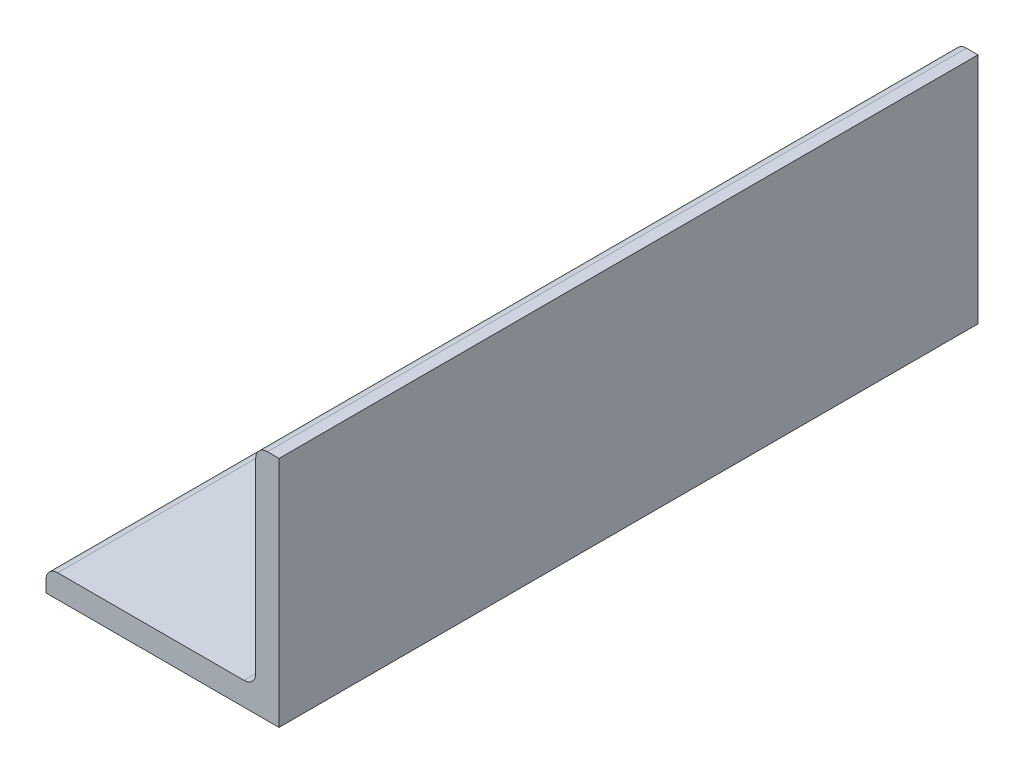
ISO-10303-21;
HEADER;
FILE_DESCRIPTION(('STEP AP214'),'2;1');
FILE_NAME('part.step','',(''),(''),'','','');
FILE_SCHEMA(('AUTOMOTIVE_DESIGN { 1 0 10303 214 1 1 1 1 }'));
ENDSEC;
DATA;
#1=APPLICATION_CONTEXT('core data for automotive mechanical design processes');
#2=APPLICATION_PROTOCOL_DEFINITION('international standard','automotive_design',2000,#1);
#3=PRODUCT_CONTEXT('',#1,'mechanical');
#4=PRODUCT('Part','Part','',(#3));
#5=PRODUCT_RELATED_PRODUCT_CATEGORY('part','',(#4));
#6=PRODUCT_DEFINITION_FORMATION('','',#4);
#7=PRODUCT_DEFINITION_CONTEXT('part definition',#1,'design');
#8=PRODUCT_DEFINITION('design','',#6,#7);
#9=PRODUCT_DEFINITION_SHAPE('','',#8);
#10=(LENGTH_UNIT() NAMED_UNIT(*) SI_UNIT(.MILLI.,.METRE.));
#11=(NAMED_UNIT(*) PLANE_ANGLE_UNIT() SI_UNIT($,.RADIAN.));
#12=(NAMED_UNIT(*) SI_UNIT($,.STERADIAN.) SOLID_ANGLE_UNIT());
#13=UNCERTAINTY_MEASURE_WITH_UNIT(LENGTH_MEASURE(1.E-05),#10,'distance_accuracy_value','');
#14=(GEOMETRIC_REPRESENTATION_CONTEXT(3) GLOBAL_UNCERTAINTY_ASSIGNED_CONTEXT((#13)) GLOBAL_UNIT_ASSIGNED_CONTEXT((#10,
#11,#12)) REPRESENTATION_CONTEXT('',''));
#15=CARTESIAN_POINT('',(0.,0.,0.));
#16=DIRECTION('',(0.,0.,1.));
#17=DIRECTION('',(1.,0.,0.));
#18=AXIS2_PLACEMENT_3D('',#15,#16,#17);
#19=CARTESIAN_POINT('',(-137.100940306666,27.,90.));
#20=DIRECTION('',(0.,-1.,0.));
#21=DIRECTION('',(0.,0.,-1.));
#22=AXIS2_PLACEMENT_3D('',#19,#20,#21);
#23=PLANE('',#22);
#24=DIRECTION('',(-1.,0.,0.));
#25=VECTOR('',#24,1.);
#26=CARTESIAN_POINT('',(-137.100940306666,27.,0.));
#27=LINE('',#26,#25);
#28=CARTESIAN_POINT('',(-135.600940306666,27.,0.));
#29=VERTEX_POINT('',#28);
#30=CARTESIAN_POINT('',(-137.100940306666,27.,0.));
#31=VERTEX_POINT('',#30);
#32=EDGE_CURVE('E135',#29,#31,#27,.T.);
#33=ORIENTED_EDGE('',*,*,#32,.T.);
#34=DIRECTION('',(0.,0.,-1.));
#35=VECTOR('',#34,1.);
#36=CARTESIAN_POINT('',(-137.100940306666,27.,90.));
#37=LINE('',#36,#35);
#38=CARTESIAN_POINT('',(-137.100940306666,27.,90.));
#39=VERTEX_POINT('',#38);
#40=EDGE_CURVE('E11',#39,#31,#37,.T.);
#41=ORIENTED_EDGE('',*,*,#40,.F.);
#42=DIRECTION('',(-1.,0.,0.));
#43=VECTOR('',#42,1.);
#44=CARTESIAN_POINT('',(-137.100940306666,27.,90.));
#45=LINE('',#44,#43);
#46=CARTESIAN_POINT('',(-135.600940306666,27.,90.));
#47=VERTEX_POINT('',#46);
#48=EDGE_CURVE('E151',#47,#39,#45,.T.);
#49=ORIENTED_EDGE('',*,*,#48,.F.);
#50=DIRECTION('',(0.,0.,-1.));
#51=VECTOR('',#50,1.);
#52=CARTESIAN_POINT('',(-135.600940306666,27.,90.));
#53=LINE('',#52,#51);
#54=EDGE_CURVE('E131',#47,#29,#53,.T.);
#55=ORIENTED_EDGE('',*,*,#54,.T.);
#56=EDGE_LOOP('',(#33,#41,#49,#55));
#57=FACE_BOUND('',#56,.T.);
#58=ADVANCED_FACE('F33',(#57),#23,.F.);
#59=CARTESIAN_POINT('',(-137.100940306666,25.5,90.));
#60=DIRECTION('',(0.,0.,-1.));
#61=DIRECTION('',(-1.,0.,0.));
#62=AXIS2_PLACEMENT_3D('',#59,#60,#61);
#63=CYLINDRICAL_SURFACE('',#62,1.5);
#64=CARTESIAN_POINT('',(-137.100940306666,25.5,0.));
#65=DIRECTION('',(0.,0.,1.));
#66=DIRECTION('',(-1.,0.,0.));
#67=AXIS2_PLACEMENT_3D('',#64,#65,#66);
#68=CIRCLE('',#67,1.5);
#69=CARTESIAN_POINT('',(-138.600940306666,25.5,0.));
#70=VERTEX_POINT('',#69);
#71=EDGE_CURVE('E138',#31,#70,#68,.T.);
#72=ORIENTED_EDGE('',*,*,#71,.T.);
#73=DIRECTION('',(0.,0.,-1.));
#74=VECTOR('',#73,1.);
#75=CARTESIAN_POINT('',(-138.600940306666,25.5,90.));
#76=LINE('',#75,#74);
#77=CARTESIAN_POINT('',(-138.600940306666,25.5,90.));
#78=VERTEX_POINT('',#77);
#79=EDGE_CURVE('E41',#78,#70,#76,.T.);
#80=ORIENTED_EDGE('',*,*,#79,.F.);
#81=CARTESIAN_POINT('',(-137.100940306666,25.5,90.));
#82=DIRECTION('',(0.,0.,1.));
#83=DIRECTION('',(-1.,0.,0.));
#84=AXIS2_PLACEMENT_3D('',#81,#82,#83);
#85=CIRCLE('',#84,1.5);
#86=EDGE_CURVE('E95',#39,#78,#85,.T.);
#87=ORIENTED_EDGE('',*,*,#86,.F.);
#88=ORIENTED_EDGE('',*,*,#40,.T.);
#89=EDGE_LOOP('',(#72,#80,#87,#88));
#90=FACE_BOUND('',#89,.T.);
#91=ADVANCED_FACE('F194',(#90),#63,.T.);
#92=CARTESIAN_POINT('',(-138.600940306666,1.50000000000001,90.));
#93=DIRECTION('',(1.,0.,0.));
#94=DIRECTION('',(0.,0.,-1.));
#95=AXIS2_PLACEMENT_3D('',#92,#93,#94);
#96=PLANE('',#95);
#97=DIRECTION('',(0.,-1.,0.));
#98=VECTOR('',#97,1.);
#99=CARTESIAN_POINT('',(-138.600940306666,1.50000000000001,0.));
#100=LINE('',#99,#98);
#101=CARTESIAN_POINT('',(-138.600940306666,1.5,0.));
#102=VERTEX_POINT('',#101);
#103=EDGE_CURVE('E140',#70,#102,#100,.T.);
#104=ORIENTED_EDGE('',*,*,#103,.T.);
#105=DIRECTION('',(0.,0.,-1.));
#106=VECTOR('',#105,1.);
#107=CARTESIAN_POINT('',(-138.600940306666,1.5,90.));
#108=LINE('',#107,#106);
#109=CARTESIAN_POINT('',(-138.600940306666,1.5,90.));
#110=VERTEX_POINT('',#109);
#111=EDGE_CURVE('E161',#110,#102,#108,.T.);
#112=ORIENTED_EDGE('',*,*,#111,.F.);
#113=DIRECTION('',(0.,-1.,0.));
#114=VECTOR('',#113,1.);
#115=CARTESIAN_POINT('',(-138.600940306666,1.50000000000001,90.));
#116=LINE('',#115,#114);
#117=EDGE_CURVE('E169',#78,#110,#116,.T.);
#118=ORIENTED_EDGE('',*,*,#117,.F.);
#119=ORIENTED_EDGE('',*,*,#79,.T.);
#120=EDGE_LOOP('',(#104,#112,#118,#119));
#121=FACE_BOUND('',#120,.T.);
#122=ADVANCED_FACE('F167',(#121),#96,.F.);
#123=CARTESIAN_POINT('',(-140.100940306666,1.5,90.));
#124=DIRECTION('',(0.,0.,-1.));
#125=DIRECTION('',(-1.,0.,0.));
#126=AXIS2_PLACEMENT_3D('',#123,#124,#125);
#127=CYLINDRICAL_SURFACE('',#126,1.5);
#128=CARTESIAN_POINT('',(-140.100940306666,1.5,0.));
#129=DIRECTION('',(0.,0.,-1.));
#130=DIRECTION('',(1.,0.,0.));
#131=AXIS2_PLACEMENT_3D('',#128,#129,#130);
#132=CIRCLE('',#131,1.5);
#133=CARTESIAN_POINT('',(-140.100940306666,0.,0.));
#134=VERTEX_POINT('',#133);
#135=EDGE_CURVE('E142',#102,#134,#132,.T.);
#136=ORIENTED_EDGE('',*,*,#135,.T.);
#137=DIRECTION('',(0.,0.,-1.));
#138=VECTOR('',#137,1.);
#139=CARTESIAN_POINT('',(-140.100940306666,0.,90.));
#140=LINE('',#139,#138);
#141=CARTESIAN_POINT('',(-140.100940306666,0.,90.));
#142=VERTEX_POINT('',#141);
#143=EDGE_CURVE('E158',#142,#134,#140,.T.);
#144=ORIENTED_EDGE('',*,*,#143,.F.);
#145=CARTESIAN_POINT('',(-140.100940306666,1.5,90.));
#146=DIRECTION('',(0.,0.,-1.));
#147=DIRECTION('',(1.,0.,0.));
#148=AXIS2_PLACEMENT_3D('',#145,#146,#147);
#149=CIRCLE('',#148,1.5);
#150=EDGE_CURVE('E185',#110,#142,#149,.T.);
#151=ORIENTED_EDGE('',*,*,#150,.F.);
#152=ORIENTED_EDGE('',*,*,#111,.T.);
#153=EDGE_LOOP('',(#136,#144,#151,#152));
#154=FACE_BOUND('',#153,.T.);
#155=ADVANCED_FACE('F178',(#154),#127,.F.);
#156=CARTESIAN_POINT('',(-164.100940306666,0.,90.));
#157=DIRECTION('',(0.,-1.,0.));
#158=DIRECTION('',(0.,0.,-1.));
#159=AXIS2_PLACEMENT_3D('',#156,#157,#158);
#160=PLANE('',#159);
#161=DIRECTION('',(-1.,0.,0.));
#162=VECTOR('',#161,1.);
#163=CARTESIAN_POINT('',(-164.100940306666,0.,0.));
#164=LINE('',#163,#162);
#165=CARTESIAN_POINT('',(-164.100940306666,0.,0.));
#166=VERTEX_POINT('',#165);
#167=EDGE_CURVE('E144',#134,#166,#164,.T.);
#168=ORIENTED_EDGE('',*,*,#167,.T.);
#169=DIRECTION('',(0.,0.,-1.));
#170=VECTOR('',#169,1.);
#171=CARTESIAN_POINT('',(-164.100940306666,0.,90.));
#172=LINE('',#171,#170);
#173=CARTESIAN_POINT('',(-164.100940306666,0.,90.));
#174=VERTEX_POINT('',#173);
#175=EDGE_CURVE('E155',#174,#166,#172,.T.);
#176=ORIENTED_EDGE('',*,*,#175,.F.);
#177=DIRECTION('',(-1.,0.,0.));
#178=VECTOR('',#177,1.);
#179=CARTESIAN_POINT('',(-164.100940306666,0.,90.));
#180=LINE('',#179,#178);
#181=EDGE_CURVE('E184',#142,#174,#180,.T.);
#182=ORIENTED_EDGE('',*,*,#181,.F.);
#183=ORIENTED_EDGE('',*,*,#143,.T.);
#184=EDGE_LOOP('',(#168,#176,#182,#183));
#185=FACE_BOUND('',#184,.T.);
#186=ADVANCED_FACE('F182',(#185),#160,.F.);
#187=CARTESIAN_POINT('',(-164.100940306666,-1.5,90.));
#188=DIRECTION('',(0.,0.,-1.));
#189=DIRECTION('',(-1.,0.,0.));
#190=AXIS2_PLACEMENT_3D('',#187,#188,#189);
#191=CYLINDRICAL_SURFACE('',#190,1.5);
#192=CARTESIAN_POINT('',(-164.100940306666,-1.5,0.));
#193=DIRECTION('',(0.,0.,1.));
#194=DIRECTION('',(-1.,0.,0.));
#195=AXIS2_PLACEMENT_3D('',#192,#193,#194);
#196=CIRCLE('',#195,1.5);
#197=CARTESIAN_POINT('',(-165.600940306666,-1.50000000000001,0.));
#198=VERTEX_POINT('',#197);
#199=EDGE_CURVE('E146',#166,#198,#196,.T.);
#200=ORIENTED_EDGE('',*,*,#199,.T.);
#201=DIRECTION('',(0.,0.,-1.));
#202=VECTOR('',#201,1.);
#203=CARTESIAN_POINT('',(-165.600940306666,-1.50000000000001,90.));
#204=LINE('',#203,#202);
#205=CARTESIAN_POINT('',(-165.600940306666,-1.50000000000001,90.));
#206=VERTEX_POINT('',#205);
#207=EDGE_CURVE('E126',#206,#198,#204,.T.);
#208=ORIENTED_EDGE('',*,*,#207,.F.);
#209=CARTESIAN_POINT('',(-164.100940306666,-1.5,90.));
#210=DIRECTION('',(0.,0.,1.));
#211=DIRECTION('',(-1.,0.,0.));
#212=AXIS2_PLACEMENT_3D('',#209,#210,#211);
#213=CIRCLE('',#212,1.5);
#214=EDGE_CURVE('E117',#174,#206,#213,.T.);
#215=ORIENTED_EDGE('',*,*,#214,.F.);
#216=ORIENTED_EDGE('',*,*,#175,.T.);
#217=EDGE_LOOP('',(#200,#208,#215,#216));
#218=FACE_BOUND('',#217,.T.);
#219=ADVANCED_FACE('F206',(#218),#191,.T.);
#220=CARTESIAN_POINT('',(-165.600940306666,-3.,90.));
#221=DIRECTION('',(1.,0.,0.));
#222=DIRECTION('',(0.,0.,-1.));
#223=AXIS2_PLACEMENT_3D('',#220,#221,#222);
#224=PLANE('',#223);
#225=DIRECTION('',(0.,-1.,0.));
#226=VECTOR('',#225,1.);
#227=CARTESIAN_POINT('',(-165.600940306666,-3.,0.));
#228=LINE('',#227,#226);
#229=CARTESIAN_POINT('',(-165.600940306666,-3.,0.));
#230=VERTEX_POINT('',#229);
#231=EDGE_CURVE('E125',#198,#230,#228,.T.);
#232=ORIENTED_EDGE('',*,*,#231,.T.);
#233=DIRECTION('',(0.,0.,-1.));
#234=VECTOR('',#233,1.);
#235=CARTESIAN_POINT('',(-165.600940306666,-3.,90.));
#236=LINE('',#235,#234);
#237=CARTESIAN_POINT('',(-165.600940306666,-3.,90.));
#238=VERTEX_POINT('',#237);
#239=EDGE_CURVE('E122',#238,#230,#236,.T.);
#240=ORIENTED_EDGE('',*,*,#239,.F.);
#241=DIRECTION('',(0.,-1.,0.));
#242=VECTOR('',#241,1.);
#243=CARTESIAN_POINT('',(-165.600940306666,-3.,90.));
#244=LINE('',#243,#242);
#245=EDGE_CURVE('E111',#206,#238,#244,.T.);
#246=ORIENTED_EDGE('',*,*,#245,.F.);
#247=ORIENTED_EDGE('',*,*,#207,.T.);
#248=EDGE_LOOP('',(#232,#240,#246,#247));
#249=FACE_BOUND('',#248,.T.);
#250=ADVANCED_FACE('F123',(#249),#224,.F.);
#251=CARTESIAN_POINT('',(-135.600940306666,-3.,90.));
#252=DIRECTION('',(0.,1.,0.));
#253=DIRECTION('',(-1.,0.,0.));
#254=AXIS2_PLACEMENT_3D('',#251,#252,#253);
#255=PLANE('',#254);
#256=DIRECTION('',(1.,0.,0.));
#257=VECTOR('',#256,1.);
#258=CARTESIAN_POINT('',(-135.600940306666,-3.,0.));
#259=LINE('',#258,#257);
#260=CARTESIAN_POINT('',(-135.600940306666,-3.,0.));
#261=VERTEX_POINT('',#260);
#262=EDGE_CURVE('E81',#230,#261,#259,.T.);
#263=ORIENTED_EDGE('',*,*,#262,.T.);
#264=DIRECTION('',(0.,0.,-1.));
#265=VECTOR('',#264,1.);
#266=CARTESIAN_POINT('',(-135.600940306666,-3.,90.));
#267=LINE('',#266,#265);
#268=CARTESIAN_POINT('',(-135.600940306666,-3.,90.));
#269=VERTEX_POINT('',#268);
#270=EDGE_CURVE('E127',#269,#261,#267,.T.);
#271=ORIENTED_EDGE('',*,*,#270,.F.);
#272=DIRECTION('',(1.,0.,0.));
#273=VECTOR('',#272,1.);
#274=CARTESIAN_POINT('',(-135.600940306666,-3.,90.));
#275=LINE('',#274,#273);
#276=EDGE_CURVE('E115',#238,#269,#275,.T.);
#277=ORIENTED_EDGE('',*,*,#276,.F.);
#278=ORIENTED_EDGE('',*,*,#239,.T.);
#279=EDGE_LOOP('',(#263,#271,#277,#278));
#280=FACE_BOUND('',#279,.T.);
#281=ADVANCED_FACE('F129',(#280),#255,.F.);
#282=CARTESIAN_POINT('',(-135.600940306666,27.,90.));
#283=DIRECTION('',(-1.,0.,0.));
#284=DIRECTION('',(0.,0.,1.));
#285=AXIS2_PLACEMENT_3D('',#282,#283,#284);
#286=PLANE('',#285);
#287=DIRECTION('',(0.,1.,0.));
#288=VECTOR('',#287,1.);
#289=CARTESIAN_POINT('',(-135.600940306666,27.,0.));
#290=LINE('',#289,#288);
#291=EDGE_CURVE('E87',#261,#29,#290,.T.);
#292=ORIENTED_EDGE('',*,*,#291,.T.);
#293=ORIENTED_EDGE('',*,*,#54,.F.);
#294=DIRECTION('',(0.,1.,0.));
#295=VECTOR('',#294,1.);
#296=CARTESIAN_POINT('',(-135.600940306666,27.,90.));
#297=LINE('',#296,#295);
#298=EDGE_CURVE('E49',#269,#47,#297,.T.);
#299=ORIENTED_EDGE('',*,*,#298,.F.);
#300=ORIENTED_EDGE('',*,*,#270,.T.);
#301=EDGE_LOOP('',(#292,#293,#299,#300));
#302=FACE_BOUND('',#301,.T.);
#303=ADVANCED_FACE('F214',(#302),#286,.F.);
#304=CARTESIAN_POINT('',(-164.100940306666,-1.5,90.));
#305=DIRECTION('',(0.,0.,-1.));
#306=DIRECTION('',(-1.,0.,0.));
#307=AXIS2_PLACEMENT_3D('',#304,#305,#306);
#308=PLANE('',#307);
#309=ORIENTED_EDGE('',*,*,#48,.T.);
#310=ORIENTED_EDGE('',*,*,#86,.T.);
#311=ORIENTED_EDGE('',*,*,#117,.T.);
#312=ORIENTED_EDGE('',*,*,#150,.T.);
#313=ORIENTED_EDGE('',*,*,#181,.T.);
#314=ORIENTED_EDGE('',*,*,#214,.T.);
#315=ORIENTED_EDGE('',*,*,#245,.T.);
#316=ORIENTED_EDGE('',*,*,#276,.T.);
#317=ORIENTED_EDGE('',*,*,#298,.T.);
#318=EDGE_LOOP('',(#309,#310,#311,#312,#313,#314,#315,#316,#317));
#319=FACE_BOUND('',#318,.T.);
#320=ADVANCED_FACE('F113',(#319),#308,.F.);
#321=CARTESIAN_POINT('',(-164.100940306666,-1.5,0.));
#322=DIRECTION('',(0.,0.,-1.));
#323=DIRECTION('',(-1.,0.,0.));
#324=AXIS2_PLACEMENT_3D('',#321,#322,#323);
#325=PLANE('',#324);
#326=ORIENTED_EDGE('',*,*,#32,.F.);
#327=ORIENTED_EDGE('',*,*,#291,.F.);
#328=ORIENTED_EDGE('',*,*,#262,.F.);
#329=ORIENTED_EDGE('',*,*,#231,.F.);
#330=ORIENTED_EDGE('',*,*,#199,.F.);
#331=ORIENTED_EDGE('',*,*,#167,.F.);
#332=ORIENTED_EDGE('',*,*,#135,.F.);
#333=ORIENTED_EDGE('',*,*,#103,.F.);
#334=ORIENTED_EDGE('',*,*,#71,.F.);
#335=EDGE_LOOP('',(#326,#327,#328,#329,#330,#331,#332,#333,#334));
#336=FACE_BOUND('',#335,.T.);
#337=ADVANCED_FACE('F173',(#336),#325,.T.);
#338=CLOSED_SHELL('',(#58,#91,#122,#155,#186,#219,#250,#281,#303,#320,#337));
#339=MANIFOLD_SOLID_BREP('B2',#338);
#340=ADVANCED_BREP_SHAPE_REPRESENTATION('',(#18,#339),#14);
#341=SHAPE_DEFINITION_REPRESENTATION(#9,#340);
ENDSEC;
END-ISO-10303-21;
